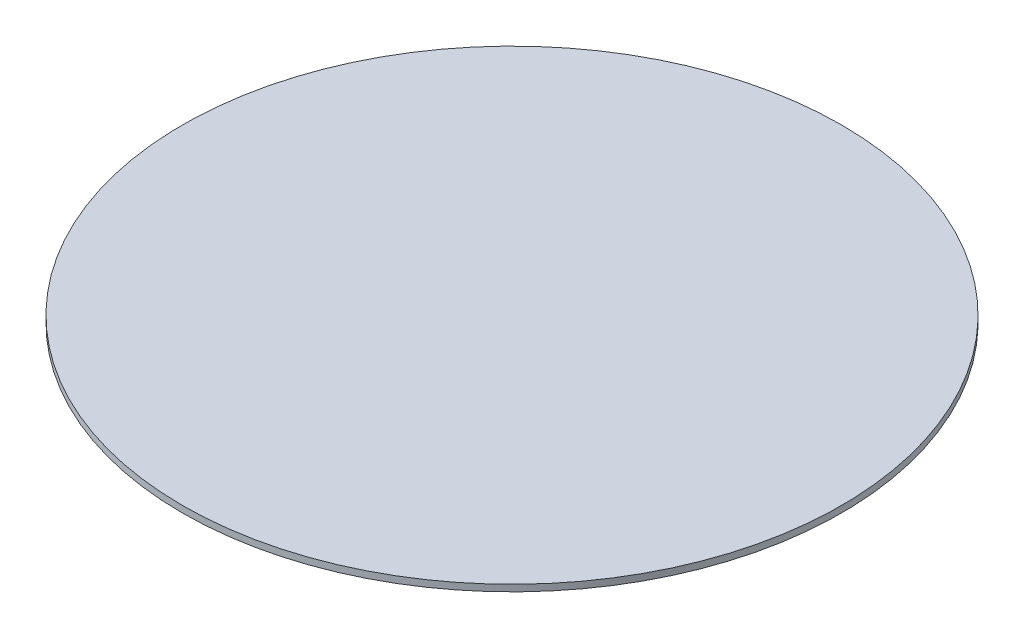
ISO-10303-21;
HEADER;
FILE_DESCRIPTION(('STEP AP214'),'2;1');
FILE_NAME('part.step','',(''),(''),'','','');
FILE_SCHEMA(('AUTOMOTIVE_DESIGN { 1 0 10303 214 1 1 1 1 }'));
ENDSEC;
DATA;
#1=APPLICATION_CONTEXT('core data for automotive mechanical design processes');
#2=APPLICATION_PROTOCOL_DEFINITION('international standard','automotive_design',2000,#1);
#3=PRODUCT_CONTEXT('',#1,'mechanical');
#4=PRODUCT('Part','Part','',(#3));
#5=PRODUCT_RELATED_PRODUCT_CATEGORY('part','',(#4));
#6=PRODUCT_DEFINITION_FORMATION('','',#4);
#7=PRODUCT_DEFINITION_CONTEXT('part definition',#1,'design');
#8=PRODUCT_DEFINITION('design','',#6,#7);
#9=PRODUCT_DEFINITION_SHAPE('','',#8);
#10=(LENGTH_UNIT() NAMED_UNIT(*) SI_UNIT(.MILLI.,.METRE.));
#11=(NAMED_UNIT(*) PLANE_ANGLE_UNIT() SI_UNIT($,.RADIAN.));
#12=(NAMED_UNIT(*) SI_UNIT($,.STERADIAN.) SOLID_ANGLE_UNIT());
#13=UNCERTAINTY_MEASURE_WITH_UNIT(LENGTH_MEASURE(1.E-05),#10,'distance_accuracy_value','');
#14=(GEOMETRIC_REPRESENTATION_CONTEXT(3) GLOBAL_UNCERTAINTY_ASSIGNED_CONTEXT((#13)) GLOBAL_UNIT_ASSIGNED_CONTEXT((#10,
#11,#12)) REPRESENTATION_CONTEXT('',''));
#15=CARTESIAN_POINT('',(0.,0.,0.));
#16=DIRECTION('',(0.,0.,1.));
#17=DIRECTION('',(1.,0.,0.));
#18=AXIS2_PLACEMENT_3D('',#15,#16,#17);
#19=CARTESIAN_POINT('',(0.,6.,0.));
#20=DIRECTION('',(0.,-1.,0.));
#21=DIRECTION('',(0.,0.,-1.));
#22=AXIS2_PLACEMENT_3D('',#19,#20,#21);
#23=CYLINDRICAL_SURFACE('',#22,300.);
#24=CARTESIAN_POINT('',(0.,6.,0.));
#25=DIRECTION('',(0.,1.,0.));
#26=DIRECTION('',(0.,0.,1.));
#27=AXIS2_PLACEMENT_3D('',#24,#25,#26);
#28=CIRCLE('',#27,300.);
#29=CARTESIAN_POINT('',(0.,6.,300.));
#30=VERTEX_POINT('',#29);
#31=EDGE_CURVE('E10',#30,#30,#28,.T.);
#32=ORIENTED_EDGE('',*,*,#31,.F.);
#33=EDGE_LOOP('',(#32));
#34=FACE_BOUND('',#33,.T.);
#35=CARTESIAN_POINT('',(0.,0.,0.));
#36=DIRECTION('',(0.,1.,0.));
#37=DIRECTION('',(0.,0.,1.));
#38=AXIS2_PLACEMENT_3D('',#35,#36,#37);
#39=CIRCLE('',#38,300.);
#40=CARTESIAN_POINT('',(0.,0.,300.));
#41=VERTEX_POINT('',#40);
#42=EDGE_CURVE('E34',#41,#41,#39,.T.);
#43=ORIENTED_EDGE('',*,*,#42,.T.);
#44=EDGE_LOOP('',(#43));
#45=FACE_BOUND('',#44,.T.);
#46=ADVANCED_FACE('F31',(#34,#45),#23,.T.);
#47=CARTESIAN_POINT('',(0.,6.,0.));
#48=DIRECTION('',(0.,1.,0.));
#49=DIRECTION('',(0.,0.,1.));
#50=AXIS2_PLACEMENT_3D('',#47,#48,#49);
#51=PLANE('',#50);
#52=ORIENTED_EDGE('',*,*,#31,.T.);
#53=EDGE_LOOP('',(#52));
#54=FACE_BOUND('',#53,.T.);
#55=ADVANCED_FACE('F46',(#54),#51,.T.);
#56=CARTESIAN_POINT('',(0.,0.,0.));
#57=DIRECTION('',(0.,1.,0.));
#58=DIRECTION('',(0.,0.,1.));
#59=AXIS2_PLACEMENT_3D('',#56,#57,#58);
#60=PLANE('',#59);
#61=ORIENTED_EDGE('',*,*,#42,.F.);
#62=EDGE_LOOP('',(#61));
#63=FACE_BOUND('',#62,.T.);
#64=ADVANCED_FACE('F44',(#63),#60,.F.);
#65=CLOSED_SHELL('',(#46,#55,#64));
#66=MANIFOLD_SOLID_BREP('B2',#65);
#67=ADVANCED_BREP_SHAPE_REPRESENTATION('',(#18,#66),#14);
#68=SHAPE_DEFINITION_REPRESENTATION(#9,#67);
ENDSEC;
END-ISO-10303-21;
